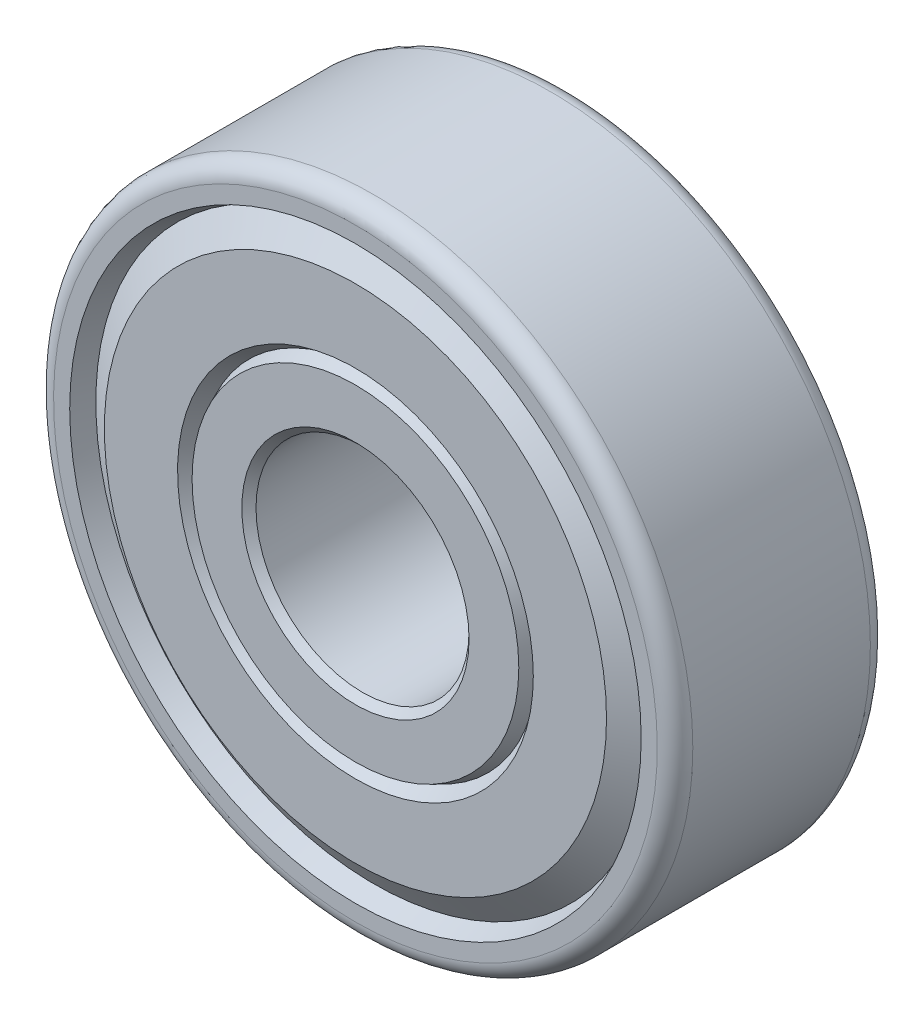
ISO-10303-21;
HEADER;
FILE_DESCRIPTION(('STEP AP214'),'2;1');
FILE_NAME('part.step','',(''),(''),'','','');
FILE_SCHEMA(('AUTOMOTIVE_DESIGN { 1 0 10303 214 1 1 1 1 }'));
ENDSEC;
DATA;
#1=APPLICATION_CONTEXT('core data for automotive mechanical design processes');
#2=APPLICATION_PROTOCOL_DEFINITION('international standard','automotive_design',2000,#1);
#3=PRODUCT_CONTEXT('',#1,'mechanical');
#4=PRODUCT('Part','Part','',(#3));
#5=PRODUCT_RELATED_PRODUCT_CATEGORY('part','',(#4));
#6=PRODUCT_DEFINITION_FORMATION('','',#4);
#7=PRODUCT_DEFINITION_CONTEXT('part definition',#1,'design');
#8=PRODUCT_DEFINITION('design','',#6,#7);
#9=PRODUCT_DEFINITION_SHAPE('','',#8);
#10=(LENGTH_UNIT() NAMED_UNIT(*) SI_UNIT(.MILLI.,.METRE.));
#11=(NAMED_UNIT(*) PLANE_ANGLE_UNIT() SI_UNIT($,.RADIAN.));
#12=(NAMED_UNIT(*) SI_UNIT($,.STERADIAN.) SOLID_ANGLE_UNIT());
#13=UNCERTAINTY_MEASURE_WITH_UNIT(LENGTH_MEASURE(1.E-05),#10,'distance_accuracy_value','');
#14=(GEOMETRIC_REPRESENTATION_CONTEXT(3) GLOBAL_UNCERTAINTY_ASSIGNED_CONTEXT((#13)) GLOBAL_UNIT_ASSIGNED_CONTEXT((#10,
#11,#12)) REPRESENTATION_CONTEXT('',''));
#15=CARTESIAN_POINT('',(0.,0.,0.));
#16=DIRECTION('',(0.,0.,1.));
#17=DIRECTION('',(1.,0.,0.));
#18=AXIS2_PLACEMENT_3D('',#15,#16,#17);
#19=CARTESIAN_POINT('',(0.,0.,30.2097125132291));
#20=DIRECTION('',(0.,0.,1.));
#21=DIRECTION('',(1.,0.,0.));
#22=AXIS2_PLACEMENT_3D('',#19,#20,#21);
#23=CONICAL_SURFACE('',#22,25.4,0.601029540118034);
#24=CARTESIAN_POINT('',(0.,0.,4.18132890087754));
#25=DIRECTION('',(0.,0.,1.));
#26=DIRECTION('',(1.,0.,0.));
#27=AXIS2_PLACEMENT_3D('',#24,#25,#26);
#28=CIRCLE('',#27,7.55365742462337);
#29=CARTESIAN_POINT('',(7.55365742462337,0.,4.18132890087754));
#30=VERTEX_POINT('',#29);
#31=EDGE_CURVE('E10',#30,#30,#28,.T.);
#32=ORIENTED_EDGE('',*,*,#31,.F.);
#33=EDGE_LOOP('',(#32));
#34=FACE_BOUND('',#33,.T.);
#35=CARTESIAN_POINT('',(0.,0.,4.7625));
#36=DIRECTION('',(0.,0.,-1.));
#37=DIRECTION('',(0.,-1.,0.));
#38=AXIS2_PLACEMENT_3D('',#35,#36,#37);
#39=CIRCLE('',#38,7.952136972928);
#40=CARTESIAN_POINT('',(0.,-7.952136972928,4.7625));
#41=VERTEX_POINT('',#40);
#42=EDGE_CURVE('E30',#41,#41,#39,.T.);
#43=ORIENTED_EDGE('',*,*,#42,.F.);
#44=EDGE_LOOP('',(#43));
#45=FACE_BOUND('',#44,.T.);
#46=ADVANCED_FACE('F14',(#34,#45),#23,.F.);
#47=CARTESIAN_POINT('',(0.,0.,-37.1145975833607));
#48=DIRECTION('',(0.,0.,-1.));
#49=DIRECTION('',(0.,-1.,0.));
#50=AXIS2_PLACEMENT_3D('',#47,#48,#49);
#51=CONICAL_SURFACE('',#50,25.4,0.407917424358415);
#52=CARTESIAN_POINT('',(0.,0.,4.7625));
#53=DIRECTION('',(0.,0.,1.));
#54=DIRECTION('',(1.,0.,0.));
#55=AXIS2_PLACEMENT_3D('',#52,#53,#54);
#56=CIRCLE('',#55,7.3025);
#57=CARTESIAN_POINT('',(7.3025,0.,4.7625));
#58=VERTEX_POINT('',#57);
#59=EDGE_CURVE('E34',#58,#58,#56,.T.);
#60=ORIENTED_EDGE('',*,*,#59,.F.);
#61=EDGE_LOOP('',(#60));
#62=FACE_BOUND('',#61,.T.);
#63=ORIENTED_EDGE('',*,*,#31,.T.);
#64=EDGE_LOOP('',(#63));
#65=FACE_BOUND('',#64,.T.);
#66=ADVANCED_FACE('F100',(#62,#65),#51,.T.);
#67=CARTESIAN_POINT('',(0.,0.,36.1467960852018));
#68=DIRECTION('',(0.,0.,1.));
#69=DIRECTION('',(1.,0.,0.));
#70=AXIS2_PLACEMENT_3D('',#67,#68,#69);
#71=CONICAL_SURFACE('',#70,25.4,0.382519397831444);
#72=CARTESIAN_POINT('',(0.,0.,3.93017144225872));
#73=DIRECTION('',(0.,0.,1.));
#74=DIRECTION('',(1.,0.,0.));
#75=AXIS2_PLACEMENT_3D('',#72,#73,#74);
#76=CIRCLE('',#75,12.4380602466955);
#77=CARTESIAN_POINT('',(12.4380602466955,0.,3.93017144225872));
#78=VERTEX_POINT('',#77);
#79=EDGE_CURVE('E22',#78,#78,#76,.T.);
#80=ORIENTED_EDGE('',*,*,#79,.F.);
#81=EDGE_LOOP('',(#80));
#82=FACE_BOUND('',#81,.T.);
#83=CARTESIAN_POINT('',(0.,0.,4.7625));
#84=DIRECTION('',(0.,0.,-1.));
#85=DIRECTION('',(0.,-1.,0.));
#86=AXIS2_PLACEMENT_3D('',#83,#84,#85);
#87=CIRCLE('',#86,12.77293681286);
#88=CARTESIAN_POINT('',(0.,-12.77293681286,4.7625));
#89=VERTEX_POINT('',#88);
#90=EDGE_CURVE('E39',#89,#89,#87,.T.);
#91=ORIENTED_EDGE('',*,*,#90,.F.);
#92=EDGE_LOOP('',(#91));
#93=FACE_BOUND('',#92,.T.);
#94=ADVANCED_FACE('F106',(#82,#93),#71,.F.);
#95=CARTESIAN_POINT('',(0.,0.,-4.95717329786068));
#96=DIRECTION('',(0.,0.,-1.));
#97=DIRECTION('',(0.,-1.,0.));
#98=AXIS2_PLACEMENT_3D('',#95,#96,#97);
#99=CONICAL_SURFACE('',#98,25.4,0.969766784881962);
#100=CARTESIAN_POINT('',(0.,0.,4.7625));
#101=DIRECTION('',(0.,0.,1.));
#102=DIRECTION('',(1.,0.,0.));
#103=AXIS2_PLACEMENT_3D('',#100,#101,#102);
#104=CIRCLE('',#103,11.2241326943492);
#105=CARTESIAN_POINT('',(11.2241326943492,0.,4.7625));
#106=VERTEX_POINT('',#105);
#107=EDGE_CURVE('E33',#106,#106,#104,.T.);
#108=ORIENTED_EDGE('',*,*,#107,.F.);
#109=EDGE_LOOP('',(#108));
#110=FACE_BOUND('',#109,.T.);
#111=ORIENTED_EDGE('',*,*,#79,.T.);
#112=EDGE_LOOP('',(#111));
#113=FACE_BOUND('',#112,.T.);
#114=ADVANCED_FACE('F116',(#110,#113),#99,.T.);
#115=CARTESIAN_POINT('',(0.,0.,-30.2097124753297));
#116=DIRECTION('',(0.,0.,-1.));
#117=DIRECTION('',(0.,-1.,0.));
#118=AXIS2_PLACEMENT_3D('',#115,#116,#117);
#119=CONICAL_SURFACE('',#118,25.4,0.601029540804805);
#120=CARTESIAN_POINT('',(0.,0.,-4.18132890087754));
#121=DIRECTION('',(0.,0.,1.));
#122=DIRECTION('',(1.,0.,0.));
#123=AXIS2_PLACEMENT_3D('',#120,#121,#122);
#124=CIRCLE('',#123,7.55365742462337);
#125=CARTESIAN_POINT('',(7.55365742462337,0.,-4.18132890087754));
#126=VERTEX_POINT('',#125);
#127=EDGE_CURVE('E27',#126,#126,#124,.T.);
#128=ORIENTED_EDGE('',*,*,#127,.T.);
#129=EDGE_LOOP('',(#128));
#130=FACE_BOUND('',#129,.T.);
#131=CARTESIAN_POINT('',(0.,0.,-4.7625));
#132=DIRECTION('',(0.,0.,1.));
#133=DIRECTION('',(1.,0.,0.));
#134=AXIS2_PLACEMENT_3D('',#131,#132,#133);
#135=CIRCLE('',#134,7.952136972928);
#136=CARTESIAN_POINT('',(7.952136972928,0.,-4.7625));
#137=VERTEX_POINT('',#136);
#138=EDGE_CURVE('E45',#137,#137,#135,.T.);
#139=ORIENTED_EDGE('',*,*,#138,.F.);
#140=EDGE_LOOP('',(#139));
#141=FACE_BOUND('',#140,.T.);
#142=ADVANCED_FACE('F120',(#130,#141),#119,.F.);
#143=CARTESIAN_POINT('',(0.,0.,37.1145975301289));
#144=DIRECTION('',(0.,0.,1.));
#145=DIRECTION('',(1.,0.,0.));
#146=AXIS2_PLACEMENT_3D('',#143,#144,#145);
#147=CONICAL_SURFACE('',#146,25.4,0.407917424824535);
#148=CARTESIAN_POINT('',(0.,0.,-4.7625));
#149=DIRECTION('',(0.,0.,-1.));
#150=DIRECTION('',(0.,-1.,0.));
#151=AXIS2_PLACEMENT_3D('',#148,#149,#150);
#152=CIRCLE('',#151,7.3025);
#153=CARTESIAN_POINT('',(0.,-7.3025,-4.7625));
#154=VERTEX_POINT('',#153);
#155=EDGE_CURVE('E36',#154,#154,#152,.T.);
#156=ORIENTED_EDGE('',*,*,#155,.F.);
#157=EDGE_LOOP('',(#156));
#158=FACE_BOUND('',#157,.T.);
#159=ORIENTED_EDGE('',*,*,#127,.F.);
#160=EDGE_LOOP('',(#159));
#161=FACE_BOUND('',#160,.T.);
#162=ADVANCED_FACE('F124',(#158,#161),#147,.T.);
#163=CARTESIAN_POINT('',(0.,0.,-36.1467960450639));
#164=DIRECTION('',(0.,0.,-1.));
#165=DIRECTION('',(0.,-1.,0.));
#166=AXIS2_PLACEMENT_3D('',#163,#164,#165);
#167=CONICAL_SURFACE('',#166,25.4,0.382519398268516);
#168=CARTESIAN_POINT('',(0.,0.,-3.93017144225872));
#169=DIRECTION('',(0.,0.,1.));
#170=DIRECTION('',(1.,0.,0.));
#171=AXIS2_PLACEMENT_3D('',#168,#169,#170);
#172=CIRCLE('',#171,12.4380602466955);
#173=CARTESIAN_POINT('',(12.4380602466955,0.,-3.93017144225872));
#174=VERTEX_POINT('',#173);
#175=EDGE_CURVE('E48',#174,#174,#172,.T.);
#176=ORIENTED_EDGE('',*,*,#175,.T.);
#177=EDGE_LOOP('',(#176));
#178=FACE_BOUND('',#177,.T.);
#179=CARTESIAN_POINT('',(0.,0.,-4.7625));
#180=DIRECTION('',(0.,0.,1.));
#181=DIRECTION('',(1.,0.,0.));
#182=AXIS2_PLACEMENT_3D('',#179,#180,#181);
#183=CIRCLE('',#182,12.77293681286);
#184=CARTESIAN_POINT('',(12.77293681286,0.,-4.7625));
#185=VERTEX_POINT('',#184);
#186=EDGE_CURVE('E37',#185,#185,#183,.T.);
#187=ORIENTED_EDGE('',*,*,#186,.F.);
#188=EDGE_LOOP('',(#187));
#189=FACE_BOUND('',#188,.T.);
#190=ADVANCED_FACE('F128',(#178,#189),#167,.F.);
#191=CARTESIAN_POINT('',(0.,0.,4.95717327575603));
#192=DIRECTION('',(0.,0.,1.));
#193=DIRECTION('',(1.,0.,0.));
#194=AXIS2_PLACEMENT_3D('',#191,#192,#193);
#195=CONICAL_SURFACE('',#194,25.4,0.969766785990084);
#196=CARTESIAN_POINT('',(0.,0.,-4.7625));
#197=DIRECTION('',(0.,0.,-1.));
#198=DIRECTION('',(0.,-1.,0.));
#199=AXIS2_PLACEMENT_3D('',#196,#197,#198);
#200=CIRCLE('',#199,11.2241326943492);
#201=CARTESIAN_POINT('',(0.,-11.2241326943492,-4.7625));
#202=VERTEX_POINT('',#201);
#203=EDGE_CURVE('E42',#202,#202,#200,.T.);
#204=ORIENTED_EDGE('',*,*,#203,.F.);
#205=EDGE_LOOP('',(#204));
#206=FACE_BOUND('',#205,.T.);
#207=ORIENTED_EDGE('',*,*,#175,.F.);
#208=EDGE_LOOP('',(#207));
#209=FACE_BOUND('',#208,.T.);
#210=ADVANCED_FACE('F132',(#206,#209),#195,.T.);
#211=CARTESIAN_POINT('',(0.,0.,3.96875));
#212=DIRECTION('',(0.,0.,-1.));
#213=DIRECTION('',(0.,-1.,0.));
#214=AXIS2_PLACEMENT_3D('',#211,#212,#213);
#215=TOROIDAL_SURFACE('',#214,13.49375,0.79375);
#216=CARTESIAN_POINT('',(0.,0.,4.7625));
#217=DIRECTION('',(0.,0.,-1.));
#218=DIRECTION('',(0.,-1.,0.));
#219=AXIS2_PLACEMENT_3D('',#216,#217,#218);
#220=CIRCLE('',#219,13.49375);
#221=CARTESIAN_POINT('',(0.,-13.49375,4.7625));
#222=VERTEX_POINT('',#221);
#223=EDGE_CURVE('E55',#222,#222,#220,.T.);
#224=ORIENTED_EDGE('',*,*,#223,.T.);
#225=EDGE_LOOP('',(#224));
#226=FACE_BOUND('',#225,.T.);
#227=CARTESIAN_POINT('',(0.,0.,3.96875));
#228=DIRECTION('',(0.,0.,1.));
#229=DIRECTION('',(1.,0.,0.));
#230=AXIS2_PLACEMENT_3D('',#227,#228,#229);
#231=CIRCLE('',#230,14.2875);
#232=CARTESIAN_POINT('',(14.2875,0.,3.96875));
#233=VERTEX_POINT('',#232);
#234=EDGE_CURVE('E62',#233,#233,#231,.T.);
#235=ORIENTED_EDGE('',*,*,#234,.T.);
#236=EDGE_LOOP('',(#235));
#237=FACE_BOUND('',#236,.T.);
#238=ADVANCED_FACE('F136',(#226,#237),#215,.T.);
#239=CARTESIAN_POINT('',(0.,0.,0.));
#240=DIRECTION('',(0.,0.,1.));
#241=DIRECTION('',(1.,0.,0.));
#242=AXIS2_PLACEMENT_3D('',#239,#240,#241);
#243=CYLINDRICAL_SURFACE('',#242,14.2875);
#244=CARTESIAN_POINT('',(0.,0.,-3.96875));
#245=DIRECTION('',(0.,0.,-1.));
#246=DIRECTION('',(0.,-1.,0.));
#247=AXIS2_PLACEMENT_3D('',#244,#245,#246);
#248=CIRCLE('',#247,14.2875);
#249=CARTESIAN_POINT('',(0.,-14.2875,-3.96875));
#250=VERTEX_POINT('',#249);
#251=EDGE_CURVE('E66',#250,#250,#248,.T.);
#252=ORIENTED_EDGE('',*,*,#251,.F.);
#253=EDGE_LOOP('',(#252));
#254=FACE_BOUND('',#253,.T.);
#255=ORIENTED_EDGE('',*,*,#234,.F.);
#256=EDGE_LOOP('',(#255));
#257=FACE_BOUND('',#256,.T.);
#258=ADVANCED_FACE('F138',(#254,#257),#243,.T.);
#259=CARTESIAN_POINT('',(0.,0.,-3.96875));
#260=DIRECTION('',(0.,0.,1.));
#261=DIRECTION('',(1.,0.,0.));
#262=AXIS2_PLACEMENT_3D('',#259,#260,#261);
#263=TOROIDAL_SURFACE('',#262,13.49375,0.79375);
#264=CARTESIAN_POINT('',(0.,0.,-4.7625));
#265=DIRECTION('',(0.,0.,1.));
#266=DIRECTION('',(1.,0.,0.));
#267=AXIS2_PLACEMENT_3D('',#264,#265,#266);
#268=CIRCLE('',#267,13.49375);
#269=CARTESIAN_POINT('',(13.49375,0.,-4.7625));
#270=VERTEX_POINT('',#269);
#271=EDGE_CURVE('E65',#270,#270,#268,.T.);
#272=ORIENTED_EDGE('',*,*,#271,.T.);
#273=EDGE_LOOP('',(#272));
#274=FACE_BOUND('',#273,.T.);
#275=ORIENTED_EDGE('',*,*,#251,.T.);
#276=EDGE_LOOP('',(#275));
#277=FACE_BOUND('',#276,.T.);
#278=ADVANCED_FACE('F141',(#274,#277),#263,.T.);
#279=CARTESIAN_POINT('',(0.,0.,25.0825000367572));
#280=DIRECTION('',(0.,0.,1.));
#281=DIRECTION('',(1.,0.,0.));
#282=AXIS2_PLACEMENT_3D('',#279,#280,#281);
#283=CONICAL_SURFACE('',#282,25.4,0.785398162500001);
#284=CARTESIAN_POINT('',(0.,0.,4.445));
#285=DIRECTION('',(0.,0.,-1.));
#286=DIRECTION('',(0.,-1.,0.));
#287=AXIS2_PLACEMENT_3D('',#284,#285,#286);
#288=CIRCLE('',#287,4.7625);
#289=CARTESIAN_POINT('',(0.,-4.7625,4.445));
#290=VERTEX_POINT('',#289);
#291=EDGE_CURVE('E69',#290,#290,#288,.T.);
#292=ORIENTED_EDGE('',*,*,#291,.T.);
#293=EDGE_LOOP('',(#292));
#294=FACE_BOUND('',#293,.T.);
#295=CARTESIAN_POINT('',(0.,0.,4.7625));
#296=DIRECTION('',(0.,0.,1.));
#297=DIRECTION('',(1.,0.,0.));
#298=AXIS2_PLACEMENT_3D('',#295,#296,#297);
#299=CIRCLE('',#298,5.08);
#300=CARTESIAN_POINT('',(5.08,0.,4.7625));
#301=VERTEX_POINT('',#300);
#302=EDGE_CURVE('E74',#301,#301,#299,.T.);
#303=ORIENTED_EDGE('',*,*,#302,.T.);
#304=EDGE_LOOP('',(#303));
#305=FACE_BOUND('',#304,.T.);
#306=ADVANCED_FACE('F144',(#294,#305),#283,.F.);
#307=CARTESIAN_POINT('',(0.,0.,0.));
#308=DIRECTION('',(0.,0.,1.));
#309=DIRECTION('',(1.,0.,0.));
#310=AXIS2_PLACEMENT_3D('',#307,#308,#309);
#311=CYLINDRICAL_SURFACE('',#310,4.7625);
#312=CARTESIAN_POINT('',(0.,0.,-4.445));
#313=DIRECTION('',(0.,0.,1.));
#314=DIRECTION('',(1.,0.,0.));
#315=AXIS2_PLACEMENT_3D('',#312,#313,#314);
#316=CIRCLE('',#315,4.7625);
#317=CARTESIAN_POINT('',(4.7625,0.,-4.445));
#318=VERTEX_POINT('',#317);
#319=EDGE_CURVE('E76',#318,#318,#316,.T.);
#320=ORIENTED_EDGE('',*,*,#319,.F.);
#321=EDGE_LOOP('',(#320));
#322=FACE_BOUND('',#321,.T.);
#323=ORIENTED_EDGE('',*,*,#291,.F.);
#324=EDGE_LOOP('',(#323));
#325=FACE_BOUND('',#324,.T.);
#326=ADVANCED_FACE('F97',(#322,#325),#311,.F.);
#327=CARTESIAN_POINT('',(0.,0.,-25.0825000367572));
#328=DIRECTION('',(0.,0.,-1.));
#329=DIRECTION('',(0.,-1.,0.));
#330=AXIS2_PLACEMENT_3D('',#327,#328,#329);
#331=CONICAL_SURFACE('',#330,25.4,0.785398162500001);
#332=ORIENTED_EDGE('',*,*,#319,.T.);
#333=EDGE_LOOP('',(#332));
#334=FACE_BOUND('',#333,.T.);
#335=CARTESIAN_POINT('',(0.,0.,-4.7625));
#336=DIRECTION('',(0.,0.,-1.));
#337=DIRECTION('',(0.,-1.,0.));
#338=AXIS2_PLACEMENT_3D('',#335,#336,#337);
#339=CIRCLE('',#338,5.08);
#340=CARTESIAN_POINT('',(0.,-5.08,-4.7625));
#341=VERTEX_POINT('',#340);
#342=EDGE_CURVE('E18',#341,#341,#339,.T.);
#343=ORIENTED_EDGE('',*,*,#342,.T.);
#344=EDGE_LOOP('',(#343));
#345=FACE_BOUND('',#344,.T.);
#346=ADVANCED_FACE('F16',(#334,#345),#331,.F.);
#347=CARTESIAN_POINT('',(0.,0.,-4.7625));
#348=DIRECTION('',(0.,0.,-1.));
#349=DIRECTION('',(-1.,0.,0.));
#350=AXIS2_PLACEMENT_3D('',#347,#348,#349);
#351=PLANE('',#350);
#352=ORIENTED_EDGE('',*,*,#155,.T.);
#353=EDGE_LOOP('',(#352));
#354=FACE_BOUND('',#353,.T.);
#355=ORIENTED_EDGE('',*,*,#342,.F.);
#356=EDGE_LOOP('',(#355));
#357=FACE_BOUND('',#356,.T.);
#358=ADVANCED_FACE('F84',(#354,#357),#351,.T.);
#359=CARTESIAN_POINT('',(0.,0.,4.7625));
#360=DIRECTION('',(0.,0.,-1.));
#361=DIRECTION('',(-1.,0.,0.));
#362=AXIS2_PLACEMENT_3D('',#359,#360,#361);
#363=PLANE('',#362);
#364=ORIENTED_EDGE('',*,*,#59,.T.);
#365=EDGE_LOOP('',(#364));
#366=FACE_BOUND('',#365,.T.);
#367=ORIENTED_EDGE('',*,*,#302,.F.);
#368=EDGE_LOOP('',(#367));
#369=FACE_BOUND('',#368,.T.);
#370=ADVANCED_FACE('F86',(#366,#369),#363,.F.);
#371=CARTESIAN_POINT('',(0.,0.,-4.7625));
#372=DIRECTION('',(0.,0.,-1.));
#373=DIRECTION('',(-1.,0.,0.));
#374=AXIS2_PLACEMENT_3D('',#371,#372,#373);
#375=PLANE('',#374);
#376=ORIENTED_EDGE('',*,*,#271,.F.);
#377=EDGE_LOOP('',(#376));
#378=FACE_BOUND('',#377,.T.);
#379=ORIENTED_EDGE('',*,*,#186,.T.);
#380=EDGE_LOOP('',(#379));
#381=FACE_BOUND('',#380,.T.);
#382=ADVANCED_FACE('F94',(#378,#381),#375,.T.);
#383=CARTESIAN_POINT('',(0.,0.,4.7625));
#384=DIRECTION('',(0.,0.,-1.));
#385=DIRECTION('',(-1.,0.,0.));
#386=AXIS2_PLACEMENT_3D('',#383,#384,#385);
#387=PLANE('',#386);
#388=ORIENTED_EDGE('',*,*,#223,.F.);
#389=EDGE_LOOP('',(#388));
#390=FACE_BOUND('',#389,.T.);
#391=ORIENTED_EDGE('',*,*,#90,.T.);
#392=EDGE_LOOP('',(#391));
#393=FACE_BOUND('',#392,.T.);
#394=ADVANCED_FACE('F170',(#390,#393),#387,.F.);
#395=CARTESIAN_POINT('',(0.,0.,-4.7625));
#396=DIRECTION('',(0.,0.,-1.));
#397=DIRECTION('',(-1.,0.,0.));
#398=AXIS2_PLACEMENT_3D('',#395,#396,#397);
#399=PLANE('',#398);
#400=ORIENTED_EDGE('',*,*,#203,.T.);
#401=EDGE_LOOP('',(#400));
#402=FACE_BOUND('',#401,.T.);
#403=ORIENTED_EDGE('',*,*,#138,.T.);
#404=EDGE_LOOP('',(#403));
#405=FACE_BOUND('',#404,.T.);
#406=ADVANCED_FACE('F173',(#402,#405),#399,.T.);
#407=CARTESIAN_POINT('',(0.,0.,4.7625));
#408=DIRECTION('',(0.,0.,-1.));
#409=DIRECTION('',(-1.,0.,0.));
#410=AXIS2_PLACEMENT_3D('',#407,#408,#409);
#411=PLANE('',#410);
#412=ORIENTED_EDGE('',*,*,#107,.T.);
#413=EDGE_LOOP('',(#412));
#414=FACE_BOUND('',#413,.T.);
#415=ORIENTED_EDGE('',*,*,#42,.T.);
#416=EDGE_LOOP('',(#415));
#417=FACE_BOUND('',#416,.T.);
#418=ADVANCED_FACE('F111',(#414,#417),#411,.F.);
#419=CLOSED_SHELL('',(#46,#66,#94,#114,#142,#162,#190,#210,#238,#258,#278,#306,#326,#346,#358,
#370,#382,#394,#406,#418));
#420=MANIFOLD_SOLID_BREP('B1',#419);
#421=ADVANCED_BREP_SHAPE_REPRESENTATION('',(#18,#420),#14);
#422=SHAPE_DEFINITION_REPRESENTATION(#9,#421);
ENDSEC;
END-ISO-10303-21;
